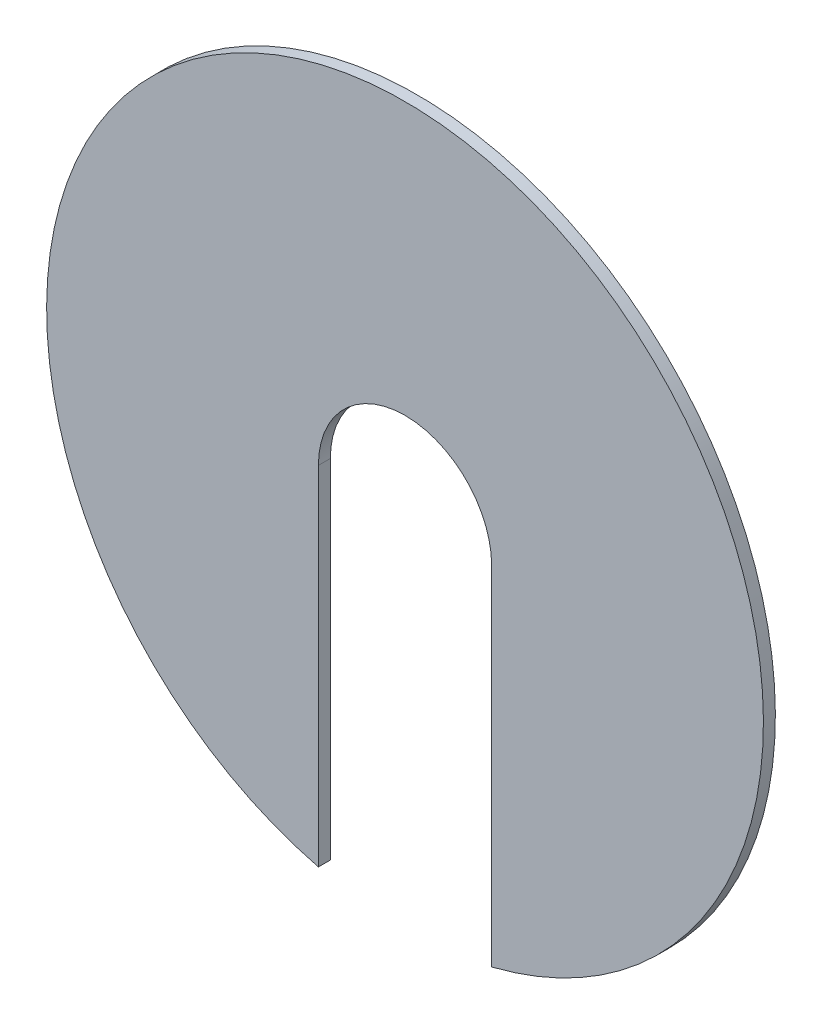
ISO-10303-21;
HEADER;
FILE_DESCRIPTION(('STEP AP214'),'2;1');
FILE_NAME('part.step','',(''),(''),'','','');
FILE_SCHEMA(('AUTOMOTIVE_DESIGN { 1 0 10303 214 1 1 1 1 }'));
ENDSEC;
DATA;
#1=APPLICATION_CONTEXT('core data for automotive mechanical design processes');
#2=APPLICATION_PROTOCOL_DEFINITION('international standard','automotive_design',2000,#1);
#3=PRODUCT_CONTEXT('',#1,'mechanical');
#4=PRODUCT('Part','Part','',(#3));
#5=PRODUCT_RELATED_PRODUCT_CATEGORY('part','',(#4));
#6=PRODUCT_DEFINITION_FORMATION('','',#4);
#7=PRODUCT_DEFINITION_CONTEXT('part definition',#1,'design');
#8=PRODUCT_DEFINITION('design','',#6,#7);
#9=PRODUCT_DEFINITION_SHAPE('','',#8);
#10=(LENGTH_UNIT() NAMED_UNIT(*) SI_UNIT(.MILLI.,.METRE.));
#11=(NAMED_UNIT(*) PLANE_ANGLE_UNIT() SI_UNIT($,.RADIAN.));
#12=(NAMED_UNIT(*) SI_UNIT($,.STERADIAN.) SOLID_ANGLE_UNIT());
#13=UNCERTAINTY_MEASURE_WITH_UNIT(LENGTH_MEASURE(1.E-05),#10,'distance_accuracy_value','');
#14=(GEOMETRIC_REPRESENTATION_CONTEXT(3) GLOBAL_UNCERTAINTY_ASSIGNED_CONTEXT((#13)) GLOBAL_UNIT_ASSIGNED_CONTEXT((#10,
#11,#12)) REPRESENTATION_CONTEXT('',''));
#15=CARTESIAN_POINT('',(0.,0.,0.));
#16=DIRECTION('',(0.,0.,1.));
#17=DIRECTION('',(1.,0.,0.));
#18=AXIS2_PLACEMENT_3D('',#15,#16,#17);
#19=CARTESIAN_POINT('',(0.,0.,0.5));
#20=DIRECTION('',(0.,0.,-1.));
#21=DIRECTION('',(-1.,0.,0.));
#22=AXIS2_PLACEMENT_3D('',#19,#20,#21);
#23=CYLINDRICAL_SURFACE('',#22,7.25);
#24=CARTESIAN_POINT('',(0.,0.,-0.5));
#25=DIRECTION('',(0.,0.,-1.));
#26=DIRECTION('',(1.,0.,0.));
#27=AXIS2_PLACEMENT_3D('',#24,#25,#26);
#28=CIRCLE('',#27,7.25);
#29=CARTESIAN_POINT('',(-7.25,0.,-0.5));
#30=VERTEX_POINT('',#29);
#31=CARTESIAN_POINT('',(7.25,0.,-0.5));
#32=VERTEX_POINT('',#31);
#33=EDGE_CURVE('E96',#30,#32,#28,.T.);
#34=ORIENTED_EDGE('',*,*,#33,.T.);
#35=DIRECTION('',(0.,0.,-1.));
#36=VECTOR('',#35,1.);
#37=CARTESIAN_POINT('',(7.25,0.,0.5));
#38=LINE('',#37,#36);
#39=CARTESIAN_POINT('',(7.25,0.,0.5));
#40=VERTEX_POINT('',#39);
#41=EDGE_CURVE('E11',#40,#32,#38,.T.);
#42=ORIENTED_EDGE('',*,*,#41,.F.);
#43=CARTESIAN_POINT('',(0.,0.,0.5));
#44=DIRECTION('',(0.,0.,-1.));
#45=DIRECTION('',(1.,0.,0.));
#46=AXIS2_PLACEMENT_3D('',#43,#44,#45);
#47=CIRCLE('',#46,7.25);
#48=CARTESIAN_POINT('',(-7.25,0.,0.5));
#49=VERTEX_POINT('',#48);
#50=EDGE_CURVE('E84',#49,#40,#47,.T.);
#51=ORIENTED_EDGE('',*,*,#50,.F.);
#52=DIRECTION('',(0.,0.,-1.));
#53=VECTOR('',#52,1.);
#54=CARTESIAN_POINT('',(-7.25,0.,0.5));
#55=LINE('',#54,#53);
#56=EDGE_CURVE('E92',#49,#30,#55,.T.);
#57=ORIENTED_EDGE('',*,*,#56,.T.);
#58=EDGE_LOOP('',(#34,#42,#51,#57));
#59=FACE_BOUND('',#58,.T.);
#60=ADVANCED_FACE('F33',(#59),#23,.F.);
#61=CARTESIAN_POINT('',(7.25,0.,0.5));
#62=DIRECTION('',(1.,0.,0.));
#63=DIRECTION('',(0.,1.,0.));
#64=AXIS2_PLACEMENT_3D('',#61,#62,#63);
#65=PLANE('',#64);
#66=DIRECTION('',(0.,-1.,0.));
#67=VECTOR('',#66,1.);
#68=CARTESIAN_POINT('',(7.25,0.,-0.5));
#69=LINE('',#68,#67);
#70=CARTESIAN_POINT('',(7.24999999999999,-29.1107797903114,-0.5));
#71=VERTEX_POINT('',#70);
#72=EDGE_CURVE('E88',#32,#71,#69,.T.);
#73=ORIENTED_EDGE('',*,*,#72,.T.);
#74=DIRECTION('',(0.,0.,-1.));
#75=VECTOR('',#74,1.);
#76=CARTESIAN_POINT('',(7.24999999999999,-29.1107797903114,0.5));
#77=LINE('',#76,#75);
#78=CARTESIAN_POINT('',(7.24999999999999,-29.1107797903114,0.5));
#79=VERTEX_POINT('',#78);
#80=EDGE_CURVE('E41',#79,#71,#77,.T.);
#81=ORIENTED_EDGE('',*,*,#80,.F.);
#82=DIRECTION('',(0.,-1.,0.));
#83=VECTOR('',#82,1.);
#84=CARTESIAN_POINT('',(7.25,0.,0.5));
#85=LINE('',#84,#83);
#86=EDGE_CURVE('E79',#40,#79,#85,.T.);
#87=ORIENTED_EDGE('',*,*,#86,.F.);
#88=ORIENTED_EDGE('',*,*,#41,.T.);
#89=EDGE_LOOP('',(#73,#81,#87,#88));
#90=FACE_BOUND('',#89,.T.);
#91=ADVANCED_FACE('F87',(#90),#65,.F.);
#92=CARTESIAN_POINT('',(0.,0.,0.5));
#93=DIRECTION('',(0.,0.,-1.));
#94=DIRECTION('',(-1.,0.,0.));
#95=AXIS2_PLACEMENT_3D('',#92,#93,#94);
#96=CYLINDRICAL_SURFACE('',#95,30.);
#97=CARTESIAN_POINT('',(0.,0.,-0.5));
#98=DIRECTION('',(0.,0.,1.));
#99=DIRECTION('',(1.,0.,0.));
#100=AXIS2_PLACEMENT_3D('',#97,#98,#99);
#101=CIRCLE('',#100,30.);
#102=CARTESIAN_POINT('',(-7.25,-29.1107797903114,-0.5));
#103=VERTEX_POINT('',#102);
#104=EDGE_CURVE('E66',#71,#103,#101,.T.);
#105=ORIENTED_EDGE('',*,*,#104,.T.);
#106=DIRECTION('',(0.,0.,-1.));
#107=VECTOR('',#106,1.);
#108=CARTESIAN_POINT('',(-7.25,-29.1107797903114,0.5));
#109=LINE('',#108,#107);
#110=CARTESIAN_POINT('',(-7.25,-29.1107797903114,0.5));
#111=VERTEX_POINT('',#110);
#112=EDGE_CURVE('E89',#111,#103,#109,.T.);
#113=ORIENTED_EDGE('',*,*,#112,.F.);
#114=CARTESIAN_POINT('',(0.,0.,0.5));
#115=DIRECTION('',(0.,0.,1.));
#116=DIRECTION('',(1.,0.,0.));
#117=AXIS2_PLACEMENT_3D('',#114,#115,#116);
#118=CIRCLE('',#117,30.);
#119=EDGE_CURVE('E82',#79,#111,#118,.T.);
#120=ORIENTED_EDGE('',*,*,#119,.F.);
#121=ORIENTED_EDGE('',*,*,#80,.T.);
#122=EDGE_LOOP('',(#105,#113,#120,#121));
#123=FACE_BOUND('',#122,.T.);
#124=ADVANCED_FACE('F90',(#123),#96,.T.);
#125=CARTESIAN_POINT('',(-7.25,0.,0.5));
#126=DIRECTION('',(-1.,0.,0.));
#127=DIRECTION('',(0.,-1.,0.));
#128=AXIS2_PLACEMENT_3D('',#125,#126,#127);
#129=PLANE('',#128);
#130=DIRECTION('',(0.,1.,0.));
#131=VECTOR('',#130,1.);
#132=CARTESIAN_POINT('',(-7.25,0.,-0.5));
#133=LINE('',#132,#131);
#134=EDGE_CURVE('E72',#103,#30,#133,.T.);
#135=ORIENTED_EDGE('',*,*,#134,.T.);
#136=ORIENTED_EDGE('',*,*,#56,.F.);
#137=DIRECTION('',(0.,1.,0.));
#138=VECTOR('',#137,1.);
#139=CARTESIAN_POINT('',(-7.25,0.,0.5));
#140=LINE('',#139,#138);
#141=EDGE_CURVE('E49',#111,#49,#140,.T.);
#142=ORIENTED_EDGE('',*,*,#141,.F.);
#143=ORIENTED_EDGE('',*,*,#112,.T.);
#144=EDGE_LOOP('',(#135,#136,#142,#143));
#145=FACE_BOUND('',#144,.T.);
#146=ADVANCED_FACE('F103',(#145),#129,.F.);
#147=CARTESIAN_POINT('',(0.,0.,0.5));
#148=DIRECTION('',(0.,0.,1.));
#149=DIRECTION('',(1.,0.,0.));
#150=AXIS2_PLACEMENT_3D('',#147,#148,#149);
#151=PLANE('',#150);
#152=ORIENTED_EDGE('',*,*,#50,.T.);
#153=ORIENTED_EDGE('',*,*,#86,.T.);
#154=ORIENTED_EDGE('',*,*,#119,.T.);
#155=ORIENTED_EDGE('',*,*,#141,.T.);
#156=EDGE_LOOP('',(#152,#153,#154,#155));
#157=FACE_BOUND('',#156,.T.);
#158=ADVANCED_FACE('F80',(#157),#151,.T.);
#159=CARTESIAN_POINT('',(0.,0.,-0.5));
#160=DIRECTION('',(0.,0.,1.));
#161=DIRECTION('',(1.,0.,0.));
#162=AXIS2_PLACEMENT_3D('',#159,#160,#161);
#163=PLANE('',#162);
#164=ORIENTED_EDGE('',*,*,#33,.F.);
#165=ORIENTED_EDGE('',*,*,#134,.F.);
#166=ORIENTED_EDGE('',*,*,#104,.F.);
#167=ORIENTED_EDGE('',*,*,#72,.F.);
#168=EDGE_LOOP('',(#164,#165,#166,#167));
#169=FACE_BOUND('',#168,.T.);
#170=ADVANCED_FACE('F106',(#169),#163,.F.);
#171=CLOSED_SHELL('',(#60,#91,#124,#146,#158,#170));
#172=MANIFOLD_SOLID_BREP('B2',#171);
#173=ADVANCED_BREP_SHAPE_REPRESENTATION('',(#18,#172),#14);
#174=SHAPE_DEFINITION_REPRESENTATION(#9,#173);
ENDSEC;
END-ISO-10303-21;
